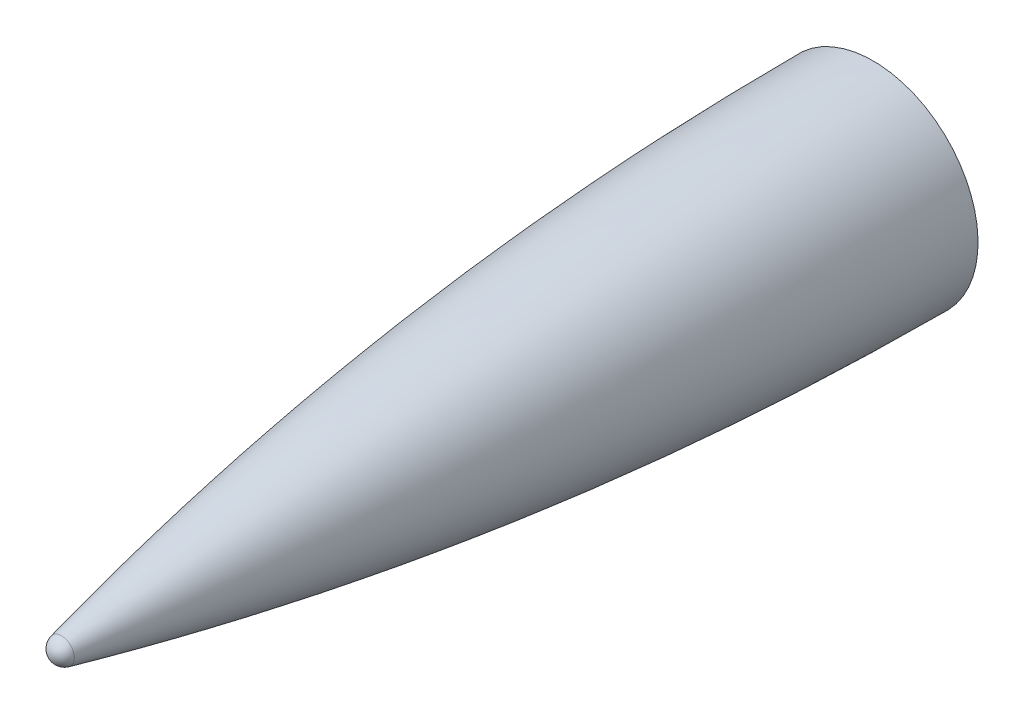
ISO-10303-21;
HEADER;
FILE_DESCRIPTION(('STEP AP214'),'2;1');
FILE_NAME('part.step','',(''),(''),'','','');
FILE_SCHEMA(('AUTOMOTIVE_DESIGN { 1 0 10303 214 1 1 1 1 }'));
ENDSEC;
DATA;
#1=APPLICATION_CONTEXT('core data for automotive mechanical design processes');
#2=APPLICATION_PROTOCOL_DEFINITION('international standard','automotive_design',2000,#1);
#3=PRODUCT_CONTEXT('',#1,'mechanical');
#4=PRODUCT('Part','Part','',(#3));
#5=PRODUCT_RELATED_PRODUCT_CATEGORY('part','',(#4));
#6=PRODUCT_DEFINITION_FORMATION('','',#4);
#7=PRODUCT_DEFINITION_CONTEXT('part definition',#1,'design');
#8=PRODUCT_DEFINITION('design','',#6,#7);
#9=PRODUCT_DEFINITION_SHAPE('','',#8);
#10=(LENGTH_UNIT() NAMED_UNIT(*) SI_UNIT(.MILLI.,.METRE.));
#11=(NAMED_UNIT(*) PLANE_ANGLE_UNIT() SI_UNIT($,.RADIAN.));
#12=(NAMED_UNIT(*) SI_UNIT($,.STERADIAN.) SOLID_ANGLE_UNIT());
#13=UNCERTAINTY_MEASURE_WITH_UNIT(LENGTH_MEASURE(1.E-05),#10,'distance_accuracy_value','');
#14=(GEOMETRIC_REPRESENTATION_CONTEXT(3) GLOBAL_UNCERTAINTY_ASSIGNED_CONTEXT((#13)) GLOBAL_UNIT_ASSIGNED_CONTEXT((#10,
#11,#12)) REPRESENTATION_CONTEXT('',''));
#15=CARTESIAN_POINT('',(0.,0.,0.));
#16=DIRECTION('',(0.,0.,1.));
#17=DIRECTION('',(1.,0.,0.));
#18=AXIS2_PLACEMENT_3D('',#15,#16,#17);
#19=CARTESIAN_POINT('',(0.,0.,0.));
#20=DIRECTION('',(0.,0.,1.));
#21=DIRECTION('',(0.,-1.,0.));
#22=AXIS2_PLACEMENT_3D('',#19,#20,#21);
#23=PLANE('',#22);
#24=CARTESIAN_POINT('',(0.,0.,0.));
#25=DIRECTION('',(0.,0.,1.));
#26=DIRECTION('',(0.,-1.,0.));
#27=AXIS2_PLACEMENT_3D('',#24,#25,#26);
#28=CIRCLE('',#27,50.8);
#29=CARTESIAN_POINT('',(0.,-50.8,0.));
#30=VERTEX_POINT('',#29);
#31=EDGE_CURVE('E10',#30,#30,#28,.T.);
#32=ORIENTED_EDGE('',*,*,#31,.F.);
#33=EDGE_LOOP('',(#32));
#34=FACE_BOUND('',#33,.T.);
#35=ADVANCED_FACE('F38',(#34),#23,.F.);
#36=CARTESIAN_POINT('',(0.,50.8000000000068,6.03947901986501E-11));
#37=CARTESIAN_POINT('',(0.,50.8000000000067,0.49200018218451));
#38=CARTESIAN_POINT('',(0.,50.7994708773874,1.49146679287433));
#39=CARTESIAN_POINT('',(0.,50.7970898256044,3.78778092814567));
#40=CARTESIAN_POINT('',(0.,50.7907403599038,5.75976020888139));
#41=CARTESIAN_POINT('',(0.,50.7812161757611,8.34064429797818));
#42=CARTESIAN_POINT('',(0.,50.76851729031,10.5727269132957));
#43=CARTESIAN_POINT('',(0.,50.7526437267084,13.0049647668807));
#44=CARTESIAN_POINT('',(0.,50.7335955134004,15.3270554880239));
#45=CARTESIAN_POINT('',(0.,50.7058169782592,18.2956014201138));
#46=CARTESIAN_POINT('',(0.,50.6661335859396,21.82481193065));
#47=CARTESIAN_POINT('',(0.,50.5947041013235,27.1404796847408));
#48=CARTESIAN_POINT('',(0.,50.4941753988259,33.0348904698547));
#49=CARTESIAN_POINT('',(0.,50.3724854696997,38.9360543067749));
#50=CARTESIAN_POINT('',(0.,50.2296361472421,44.8326363495846));
#51=CARTESIAN_POINT('',(0.,50.1026618846228,49.5514114972792));
#52=CARTESIAN_POINT('',(0.,49.9280766929905,55.4481916725815));
#53=CARTESIAN_POINT('',(0.,49.6931887259912,62.5241909541732));
#54=CARTESIAN_POINT('',(0.,49.2932646754295,73.1360889356852));
#55=CARTESIAN_POINT('',(0.,48.7643136651194,84.9238970352086));
#56=CARTESIAN_POINT('',(0.,48.1508010223504,96.7074719749439));
#57=CARTESIAN_POINT('',(0.,47.313156137136,110.842109394634));
#58=CARTESIAN_POINT('',(0.,46.530620748803,122.615699153458));
#59=CARTESIAN_POINT('',(0.,45.6636317782878,134.383399305715));
#60=CARTESIAN_POINT('',(0.,44.7122401728565,146.144483906767));
#61=CARTESIAN_POINT('',(0.,43.4946418112377,160.251447318748));
#62=CARTESIAN_POINT('',(0.,41.9265384591369,176.696426320019));
#63=CARTESIAN_POINT('',(0.,40.181523173963,193.123747310508));
#64=CARTESIAN_POINT('',(0.,38.2598578858419,209.531002505452));
#65=CARTESIAN_POINT('',(0.,36.5118629137907,223.582115235896));
#66=CARTESIAN_POINT('',(0.,34.6630963690816,237.620375857986));
#67=CARTESIAN_POINT('',(0.,32.6884690070941,251.641677431759));
#68=CARTESIAN_POINT('',(0.,30.5882144510546,265.644479941854));
#69=CARTESIAN_POINT('',(0.,28.3875223913536,279.63192810858));
#70=CARTESIAN_POINT('',(0.,26.0865871868874,293.603006318161));
#71=CARTESIAN_POINT('',(0.,23.8624682793443,306.391088708934));
#72=CARTESIAN_POINT('',(0.,21.7470064623816,317.998879836378));
#73=CARTESIAN_POINT('',(0.,20.2222265258998,326.117332404467));
#74=CARTESIAN_POINT('',(0.,19.338908464558,330.75207667116));
#75=CARTESIAN_POINT('',(0.,18.2179271458178,336.547927411415));
#76=CARTESIAN_POINT('',(0.,16.8503497913463,343.487091036118));
#77=CARTESIAN_POINT('',(0.,15.4473742519239,350.438590771421));
#78=CARTESIAN_POINT('',(0.,14.0196355990712,357.356154026933));
#79=CARTESIAN_POINT('',(0.,12.557770181191,364.308819986139));
#80=CARTESIAN_POINT('',(0.,11.3344052113255,370.03064463757));
#81=CARTESIAN_POINT('',(0.,10.0602432300558,375.87894601128));
#82=CARTESIAN_POINT('',(0.,8.81401722869635,381.51130901238));
#83=CARTESIAN_POINT('',(0.,7.85888334790071,385.764371439077));
#84=CARTESIAN_POINT('',(0.,7.16723386223554,388.821951047414));
#85=CARTESIAN_POINT('',(0.,6.51742621385599,391.66214173177));
#86=CARTESIAN_POINT('',(0.,6.29876253145922,392.615474646296));
#87=CARTESIAN_POINT('',(0.,6.18851044498665,393.094962658201));
#88=B_SPLINE_CURVE_WITH_KNOTS('',4,(#36,#37,#38,#39,#40,#41,#42,#43,#44,#45,#46,#47,#48,#49,#50,
#51,#52,#53,#54,#55,#56,#57,#58,#59,#60,#61,#62,#63,#64,#65,#66,#67,#68,#69,#70,#71,#72,#73,#74,
#75,#76,#77,#78,#79,#80,#81,#82,#83,#84,#85,#86,#87),.UNSPECIFIED.,.F.,.F.,(5,1,1,1,1,1,1,1,1,1,
1,1,1,1,1,1,1,1,1,1,1,1,1,1,1,1,1,1,1,1,1,1,1,1,1,1,1,1,1,1,1,1,1,1,1,1,1,1,5),
(0.0833700657266758,0.0883339788682041,0.0932978920097325,0.0982618051512608,0.103225718292789,
0.108189631434317,0.113153544575846,0.118117457717374,0.123081370858903,0.133009197130823,
0.142937023402744,0.162792675946585,0.172720502516443,0.182648329086302,0.192576155656161,
0.20250398222602,0.222359634361083,0.242215286496147,0.28192659121753,0.301782244550325,
0.32163789788312,0.361349202340832,0.38120485508158,0.401060507822327,0.420916161355922,
0.480483117579693,0.520194422714787,0.540050076936293,0.559905731157798,0.599617033930329,
0.639328338529413,0.65918399207456,0.679039645619708,0.718750948495487,0.758462253359617,
0.768390080735766,0.778317908111915,0.788245735488064,0.798173562864213,0.818029212623428,
0.837884862382642,0.847812689254429,0.857740516126215,0.877596169869788,0.88752399813805,
0.897451826406311,0.907379654674573,0.912343568808704,0.917307482942834),.UNSPECIFIED.);
#89=CARTESIAN_POINT('',(0.,0.,398.021994467309));
#90=DIRECTION('',(0.,0.,1.));
#91=AXIS1_PLACEMENT('',#89,#90);
#92=SURFACE_OF_REVOLUTION('',#88,#91);
#93=CARTESIAN_POINT('',(0.,0.,393.094962658201));
#94=DIRECTION('',(0.,0.,1.));
#95=DIRECTION('',(0.,-1.,0.));
#96=AXIS2_PLACEMENT_3D('',#93,#94,#95);
#97=CIRCLE('',#96,6.1885104449867);
#98=CARTESIAN_POINT('',(0.,-6.18851044498675,393.094962658201));
#99=VERTEX_POINT('',#98);
#100=EDGE_CURVE('E44',#99,#99,#97,.T.);
#101=ORIENTED_EDGE('',*,*,#100,.F.);
#102=EDGE_LOOP('',(#101));
#103=FACE_BOUND('',#102,.T.);
#104=ORIENTED_EDGE('',*,*,#31,.T.);
#105=EDGE_LOOP('',(#104));
#106=FACE_BOUND('',#105,.T.);
#107=ADVANCED_FACE('F57',(#103,#106),#92,.T.);
#108=CARTESIAN_POINT('',(0.,0.,391.671994467309));
#109=DIRECTION('',(0.,0.,1.));
#110=DIRECTION('',(0.,1.,0.));
#111=AXIS2_PLACEMENT_3D('',#108,#109,#110);
#112=SPHERICAL_SURFACE('',#111,6.35000000000002);
#113=ORIENTED_EDGE('',*,*,#100,.T.);
#114=EDGE_LOOP('',(#113));
#115=FACE_BOUND('',#114,.T.);
#116=ADVANCED_FACE('F60',(#115),#112,.T.);
#117=CLOSED_SHELL('',(#35,#107,#116));
#118=MANIFOLD_SOLID_BREP('B2',#117);
#119=ADVANCED_BREP_SHAPE_REPRESENTATION('',(#18,#118),#14);
#120=SHAPE_DEFINITION_REPRESENTATION(#9,#119);
ENDSEC;
END-ISO-10303-21;
